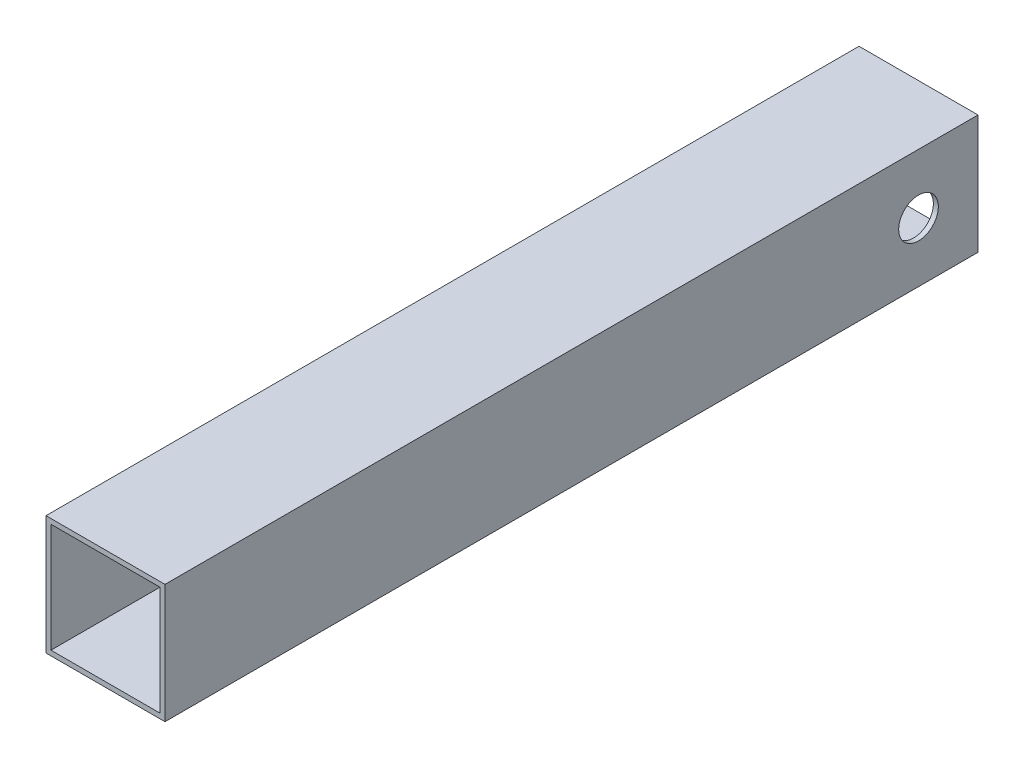
ISO-10303-21;
HEADER;
FILE_DESCRIPTION(('STEP AP214'),'2;1');
FILE_NAME('part.step','',(''),(''),'','','');
FILE_SCHEMA(('AUTOMOTIVE_DESIGN { 1 0 10303 214 1 1 1 1 }'));
ENDSEC;
DATA;
#1=APPLICATION_CONTEXT('core data for automotive mechanical design processes');
#2=APPLICATION_PROTOCOL_DEFINITION('international standard','automotive_design',2000,#1);
#3=PRODUCT_CONTEXT('',#1,'mechanical');
#4=PRODUCT('Part','Part','',(#3));
#5=PRODUCT_RELATED_PRODUCT_CATEGORY('part','',(#4));
#6=PRODUCT_DEFINITION_FORMATION('','',#4);
#7=PRODUCT_DEFINITION_CONTEXT('part definition',#1,'design');
#8=PRODUCT_DEFINITION('design','',#6,#7);
#9=PRODUCT_DEFINITION_SHAPE('','',#8);
#10=(LENGTH_UNIT() NAMED_UNIT(*) SI_UNIT(.MILLI.,.METRE.));
#11=(NAMED_UNIT(*) PLANE_ANGLE_UNIT() SI_UNIT($,.RADIAN.));
#12=(NAMED_UNIT(*) SI_UNIT($,.STERADIAN.) SOLID_ANGLE_UNIT());
#13=UNCERTAINTY_MEASURE_WITH_UNIT(LENGTH_MEASURE(1.E-05),#10,'distance_accuracy_value','');
#14=(GEOMETRIC_REPRESENTATION_CONTEXT(3) GLOBAL_UNCERTAINTY_ASSIGNED_CONTEXT((#13)) GLOBAL_UNIT_ASSIGNED_CONTEXT((#10,
#11,#12)) REPRESENTATION_CONTEXT('',''));
#15=CARTESIAN_POINT('',(0.,0.,0.));
#16=DIRECTION('',(0.,0.,1.));
#17=DIRECTION('',(1.,0.,0.));
#18=AXIS2_PLACEMENT_3D('',#15,#16,#17);
#19=CARTESIAN_POINT('',(0.,0.,260.35));
#20=DIRECTION('',(0.,0.,-1.));
#21=DIRECTION('',(-1.,0.,0.));
#22=AXIS2_PLACEMENT_3D('',#19,#20,#21);
#23=PLANE('',#22);
#24=DIRECTION('',(0.,-1.,0.));
#25=VECTOR('',#24,1.);
#26=CARTESIAN_POINT('',(0.,0.,260.35));
#27=LINE('',#26,#25);
#28=CARTESIAN_POINT('',(0.,38.1,260.35));
#29=VERTEX_POINT('',#28);
#30=CARTESIAN_POINT('',(0.,0.,260.35));
#31=VERTEX_POINT('',#30);
#32=EDGE_CURVE('E137',#29,#31,#27,.T.);
#33=ORIENTED_EDGE('',*,*,#32,.T.);
#34=DIRECTION('',(1.,0.,0.));
#35=VECTOR('',#34,1.);
#36=CARTESIAN_POINT('',(0.,0.,260.35));
#37=LINE('',#36,#35);
#38=CARTESIAN_POINT('',(38.1,0.,260.35));
#39=VERTEX_POINT('',#38);
#40=EDGE_CURVE('E140',#31,#39,#37,.T.);
#41=ORIENTED_EDGE('',*,*,#40,.T.);
#42=DIRECTION('',(0.,1.,0.));
#43=VECTOR('',#42,1.);
#44=CARTESIAN_POINT('',(38.1,0.,260.35));
#45=LINE('',#44,#43);
#46=CARTESIAN_POINT('',(38.1,38.1,260.35));
#47=VERTEX_POINT('',#46);
#48=EDGE_CURVE('E143',#39,#47,#45,.T.);
#49=ORIENTED_EDGE('',*,*,#48,.T.);
#50=DIRECTION('',(-1.,0.,0.));
#51=VECTOR('',#50,1.);
#52=CARTESIAN_POINT('',(0.,38.1,260.35));
#53=LINE('',#52,#51);
#54=EDGE_CURVE('E145',#47,#29,#53,.T.);
#55=ORIENTED_EDGE('',*,*,#54,.T.);
#56=EDGE_LOOP('',(#33,#41,#49,#55));
#57=FACE_BOUND('',#56,.T.);
#58=DIRECTION('',(0.,-1.,0.));
#59=VECTOR('',#58,1.);
#60=CARTESIAN_POINT('',(1.5875,1.5875,260.35));
#61=LINE('',#60,#59);
#62=CARTESIAN_POINT('',(1.5875,36.5125,260.35));
#63=VERTEX_POINT('',#62);
#64=CARTESIAN_POINT('',(1.5875,1.5875,260.35));
#65=VERTEX_POINT('',#64);
#66=EDGE_CURVE('E99',#63,#65,#61,.T.);
#67=ORIENTED_EDGE('',*,*,#66,.F.);
#68=DIRECTION('',(-1.,0.,0.));
#69=VECTOR('',#68,1.);
#70=CARTESIAN_POINT('',(1.5875,36.5125,260.35));
#71=LINE('',#70,#69);
#72=CARTESIAN_POINT('',(36.5125,36.5125,260.35));
#73=VERTEX_POINT('',#72);
#74=EDGE_CURVE('E121',#73,#63,#71,.T.);
#75=ORIENTED_EDGE('',*,*,#74,.F.);
#76=DIRECTION('',(0.,1.,0.));
#77=VECTOR('',#76,1.);
#78=CARTESIAN_POINT('',(36.5125,1.5875,260.35));
#79=LINE('',#78,#77);
#80=CARTESIAN_POINT('',(36.5125,1.5875,260.35));
#81=VERTEX_POINT('',#80);
#82=EDGE_CURVE('E119',#81,#73,#79,.T.);
#83=ORIENTED_EDGE('',*,*,#82,.F.);
#84=DIRECTION('',(1.,0.,0.));
#85=VECTOR('',#84,1.);
#86=CARTESIAN_POINT('',(1.5875,1.5875,260.35));
#87=LINE('',#86,#85);
#88=EDGE_CURVE('E107',#65,#81,#87,.T.);
#89=ORIENTED_EDGE('',*,*,#88,.F.);
#90=EDGE_LOOP('',(#67,#75,#83,#89));
#91=FACE_BOUND('',#90,.T.);
#92=ADVANCED_FACE('F33',(#57,#91),#23,.F.);
#93=CARTESIAN_POINT('',(0.,0.,0.));
#94=DIRECTION('',(0.,0.,-1.));
#95=DIRECTION('',(-1.,0.,0.));
#96=AXIS2_PLACEMENT_3D('',#93,#94,#95);
#97=PLANE('',#96);
#98=DIRECTION('',(0.,-1.,0.));
#99=VECTOR('',#98,1.);
#100=CARTESIAN_POINT('',(0.,0.,0.));
#101=LINE('',#100,#99);
#102=CARTESIAN_POINT('',(0.,38.1,0.));
#103=VERTEX_POINT('',#102);
#104=CARTESIAN_POINT('',(0.,0.,0.));
#105=VERTEX_POINT('',#104);
#106=EDGE_CURVE('E115',#103,#105,#101,.T.);
#107=ORIENTED_EDGE('',*,*,#106,.F.);
#108=DIRECTION('',(-1.,0.,0.));
#109=VECTOR('',#108,1.);
#110=CARTESIAN_POINT('',(0.,38.1,0.));
#111=LINE('',#110,#109);
#112=CARTESIAN_POINT('',(38.1,38.1,0.));
#113=VERTEX_POINT('',#112);
#114=EDGE_CURVE('E141',#113,#103,#111,.T.);
#115=ORIENTED_EDGE('',*,*,#114,.F.);
#116=DIRECTION('',(0.,1.,0.));
#117=VECTOR('',#116,1.);
#118=CARTESIAN_POINT('',(38.1,0.,0.));
#119=LINE('',#118,#117);
#120=CARTESIAN_POINT('',(38.1,0.,0.));
#121=VERTEX_POINT('',#120);
#122=EDGE_CURVE('E152',#121,#113,#119,.T.);
#123=ORIENTED_EDGE('',*,*,#122,.F.);
#124=DIRECTION('',(1.,0.,0.));
#125=VECTOR('',#124,1.);
#126=CARTESIAN_POINT('',(0.,0.,0.));
#127=LINE('',#126,#125);
#128=EDGE_CURVE('E150',#105,#121,#127,.T.);
#129=ORIENTED_EDGE('',*,*,#128,.F.);
#130=EDGE_LOOP('',(#107,#115,#123,#129));
#131=FACE_BOUND('',#130,.T.);
#132=DIRECTION('',(-1.,0.,0.));
#133=VECTOR('',#132,1.);
#134=CARTESIAN_POINT('',(1.5875,36.5125,0.));
#135=LINE('',#134,#133);
#136=CARTESIAN_POINT('',(36.5125,36.5125,0.));
#137=VERTEX_POINT('',#136);
#138=CARTESIAN_POINT('',(1.5875,36.5125,0.));
#139=VERTEX_POINT('',#138);
#140=EDGE_CURVE('E108',#137,#139,#135,.T.);
#141=ORIENTED_EDGE('',*,*,#140,.T.);
#142=DIRECTION('',(0.,-1.,0.));
#143=VECTOR('',#142,1.);
#144=CARTESIAN_POINT('',(1.5875,1.5875,0.));
#145=LINE('',#144,#143);
#146=CARTESIAN_POINT('',(1.5875,1.5875,0.));
#147=VERTEX_POINT('',#146);
#148=EDGE_CURVE('E57',#139,#147,#145,.T.);
#149=ORIENTED_EDGE('',*,*,#148,.T.);
#150=DIRECTION('',(1.,0.,0.));
#151=VECTOR('',#150,1.);
#152=CARTESIAN_POINT('',(1.5875,1.5875,0.));
#153=LINE('',#152,#151);
#154=CARTESIAN_POINT('',(36.5125,1.5875,0.));
#155=VERTEX_POINT('',#154);
#156=EDGE_CURVE('E114',#147,#155,#153,.T.);
#157=ORIENTED_EDGE('',*,*,#156,.T.);
#158=DIRECTION('',(0.,1.,0.));
#159=VECTOR('',#158,1.);
#160=CARTESIAN_POINT('',(36.5125,1.5875,0.));
#161=LINE('',#160,#159);
#162=EDGE_CURVE('E129',#155,#137,#161,.T.);
#163=ORIENTED_EDGE('',*,*,#162,.T.);
#164=EDGE_LOOP('',(#141,#149,#157,#163));
#165=FACE_BOUND('',#164,.T.);
#166=ADVANCED_FACE('F171',(#131,#165),#97,.T.);
#167=CARTESIAN_POINT('',(0.,0.,260.35));
#168=DIRECTION('',(1.,0.,0.));
#169=DIRECTION('',(0.,0.,-1.));
#170=AXIS2_PLACEMENT_3D('',#167,#168,#169);
#171=PLANE('',#170);
#172=CARTESIAN_POINT('',(0.,19.05,19.05));
#173=DIRECTION('',(-1.,0.,0.));
#174=DIRECTION('',(0.,0.,1.));
#175=AXIS2_PLACEMENT_3D('',#172,#173,#174);
#176=CIRCLE('',#175,6.35);
#177=CARTESIAN_POINT('',(0.,19.05,25.4));
#178=VERTEX_POINT('',#177);
#179=EDGE_CURVE('E219',#178,#178,#176,.T.);
#180=ORIENTED_EDGE('',*,*,#179,.F.);
#181=EDGE_LOOP('',(#180));
#182=FACE_BOUND('',#181,.T.);
#183=ORIENTED_EDGE('',*,*,#106,.T.);
#184=DIRECTION('',(0.,0.,-1.));
#185=VECTOR('',#184,1.);
#186=CARTESIAN_POINT('',(0.,0.,260.35));
#187=LINE('',#186,#185);
#188=EDGE_CURVE('E11',#31,#105,#187,.T.);
#189=ORIENTED_EDGE('',*,*,#188,.F.);
#190=ORIENTED_EDGE('',*,*,#32,.F.);
#191=DIRECTION('',(0.,0.,-1.));
#192=VECTOR('',#191,1.);
#193=CARTESIAN_POINT('',(0.,38.1,260.35));
#194=LINE('',#193,#192);
#195=EDGE_CURVE('E147',#29,#103,#194,.T.);
#196=ORIENTED_EDGE('',*,*,#195,.T.);
#197=EDGE_LOOP('',(#183,#189,#190,#196));
#198=FACE_BOUND('',#197,.T.);
#199=ADVANCED_FACE('F35',(#182,#198),#171,.F.);
#200=CARTESIAN_POINT('',(0.,0.,260.35));
#201=DIRECTION('',(0.,1.,0.));
#202=DIRECTION('',(0.,0.,1.));
#203=AXIS2_PLACEMENT_3D('',#200,#201,#202);
#204=PLANE('',#203);
#205=ORIENTED_EDGE('',*,*,#128,.T.);
#206=DIRECTION('',(0.,0.,-1.));
#207=VECTOR('',#206,1.);
#208=CARTESIAN_POINT('',(38.1,0.,260.35));
#209=LINE('',#208,#207);
#210=EDGE_CURVE('E42',#39,#121,#209,.T.);
#211=ORIENTED_EDGE('',*,*,#210,.F.);
#212=ORIENTED_EDGE('',*,*,#40,.F.);
#213=ORIENTED_EDGE('',*,*,#188,.T.);
#214=EDGE_LOOP('',(#205,#211,#212,#213));
#215=FACE_BOUND('',#214,.T.);
#216=ADVANCED_FACE('F181',(#215),#204,.F.);
#217=CARTESIAN_POINT('',(38.1,0.,260.35));
#218=DIRECTION('',(-1.,0.,0.));
#219=DIRECTION('',(0.,0.,1.));
#220=AXIS2_PLACEMENT_3D('',#217,#218,#219);
#221=PLANE('',#220);
#222=CARTESIAN_POINT('',(38.1,19.05,19.05));
#223=DIRECTION('',(-1.,0.,0.));
#224=DIRECTION('',(0.,0.,1.));
#225=AXIS2_PLACEMENT_3D('',#222,#223,#224);
#226=CIRCLE('',#225,6.34999999999999);
#227=CARTESIAN_POINT('',(38.1,19.05,25.4));
#228=VERTEX_POINT('',#227);
#229=EDGE_CURVE('E215',#228,#228,#226,.T.);
#230=ORIENTED_EDGE('',*,*,#229,.T.);
#231=EDGE_LOOP('',(#230));
#232=FACE_BOUND('',#231,.T.);
#233=ORIENTED_EDGE('',*,*,#122,.T.);
#234=DIRECTION('',(0.,0.,-1.));
#235=VECTOR('',#234,1.);
#236=CARTESIAN_POINT('',(38.1,38.1,260.35));
#237=LINE('',#236,#235);
#238=EDGE_CURVE('E157',#47,#113,#237,.T.);
#239=ORIENTED_EDGE('',*,*,#238,.F.);
#240=ORIENTED_EDGE('',*,*,#48,.F.);
#241=ORIENTED_EDGE('',*,*,#210,.T.);
#242=EDGE_LOOP('',(#233,#239,#240,#241));
#243=FACE_BOUND('',#242,.T.);
#244=ADVANCED_FACE('F165',(#232,#243),#221,.F.);
#245=CARTESIAN_POINT('',(0.,38.1,260.35));
#246=DIRECTION('',(0.,-1.,0.));
#247=DIRECTION('',(0.,0.,-1.));
#248=AXIS2_PLACEMENT_3D('',#245,#246,#247);
#249=PLANE('',#248);
#250=ORIENTED_EDGE('',*,*,#114,.T.);
#251=ORIENTED_EDGE('',*,*,#195,.F.);
#252=ORIENTED_EDGE('',*,*,#54,.F.);
#253=ORIENTED_EDGE('',*,*,#238,.T.);
#254=EDGE_LOOP('',(#250,#251,#252,#253));
#255=FACE_BOUND('',#254,.T.);
#256=ADVANCED_FACE('F175',(#255),#249,.F.);
#257=CARTESIAN_POINT('',(1.5875,1.5875,260.35));
#258=DIRECTION('',(1.,0.,0.));
#259=DIRECTION('',(0.,1.,0.));
#260=AXIS2_PLACEMENT_3D('',#257,#258,#259);
#261=PLANE('',#260);
#262=CARTESIAN_POINT('',(1.5875,19.05,19.05));
#263=DIRECTION('',(1.,0.,0.));
#264=DIRECTION('',(0.,1.,0.));
#265=AXIS2_PLACEMENT_3D('',#262,#263,#264);
#266=CIRCLE('',#265,6.34999999999999);
#267=CARTESIAN_POINT('',(1.5875,25.4,19.05));
#268=VERTEX_POINT('',#267);
#269=EDGE_CURVE('E127',#268,#268,#266,.T.);
#270=ORIENTED_EDGE('',*,*,#269,.F.);
#271=EDGE_LOOP('',(#270));
#272=FACE_BOUND('',#271,.T.);
#273=ORIENTED_EDGE('',*,*,#148,.F.);
#274=DIRECTION('',(0.,0.,-1.));
#275=VECTOR('',#274,1.);
#276=CARTESIAN_POINT('',(1.5875,36.5125,260.35));
#277=LINE('',#276,#275);
#278=EDGE_CURVE('E103',#63,#139,#277,.T.);
#279=ORIENTED_EDGE('',*,*,#278,.F.);
#280=ORIENTED_EDGE('',*,*,#66,.T.);
#281=DIRECTION('',(0.,0.,-1.));
#282=VECTOR('',#281,1.);
#283=CARTESIAN_POINT('',(1.5875,1.5875,260.35));
#284=LINE('',#283,#282);
#285=EDGE_CURVE('E102',#65,#147,#284,.T.);
#286=ORIENTED_EDGE('',*,*,#285,.T.);
#287=EDGE_LOOP('',(#273,#279,#280,#286));
#288=FACE_BOUND('',#287,.T.);
#289=ADVANCED_FACE('F101',(#272,#288),#261,.T.);
#290=CARTESIAN_POINT('',(1.5875,1.5875,260.35));
#291=DIRECTION('',(0.,1.,0.));
#292=DIRECTION('',(0.,0.,1.));
#293=AXIS2_PLACEMENT_3D('',#290,#291,#292);
#294=PLANE('',#293);
#295=ORIENTED_EDGE('',*,*,#156,.F.);
#296=ORIENTED_EDGE('',*,*,#285,.F.);
#297=ORIENTED_EDGE('',*,*,#88,.T.);
#298=DIRECTION('',(0.,0.,-1.));
#299=VECTOR('',#298,1.);
#300=CARTESIAN_POINT('',(36.5125,1.5875,260.35));
#301=LINE('',#300,#299);
#302=EDGE_CURVE('E116',#81,#155,#301,.T.);
#303=ORIENTED_EDGE('',*,*,#302,.T.);
#304=EDGE_LOOP('',(#295,#296,#297,#303));
#305=FACE_BOUND('',#304,.T.);
#306=ADVANCED_FACE('F111',(#305),#294,.T.);
#307=CARTESIAN_POINT('',(36.5125,1.5875,260.35));
#308=DIRECTION('',(-1.,0.,0.));
#309=DIRECTION('',(0.,0.,1.));
#310=AXIS2_PLACEMENT_3D('',#307,#308,#309);
#311=PLANE('',#310);
#312=CARTESIAN_POINT('',(36.5125,19.05,19.05));
#313=DIRECTION('',(-1.,0.,0.));
#314=DIRECTION('',(0.,0.,1.));
#315=AXIS2_PLACEMENT_3D('',#312,#313,#314);
#316=CIRCLE('',#315,6.34999999999999);
#317=CARTESIAN_POINT('',(36.5125,19.05,25.4));
#318=VERTEX_POINT('',#317);
#319=EDGE_CURVE('E37',#318,#318,#316,.T.);
#320=ORIENTED_EDGE('',*,*,#319,.F.);
#321=EDGE_LOOP('',(#320));
#322=FACE_BOUND('',#321,.T.);
#323=ORIENTED_EDGE('',*,*,#162,.F.);
#324=ORIENTED_EDGE('',*,*,#302,.F.);
#325=ORIENTED_EDGE('',*,*,#82,.T.);
#326=DIRECTION('',(0.,0.,-1.));
#327=VECTOR('',#326,1.);
#328=CARTESIAN_POINT('',(36.5125,36.5125,260.35));
#329=LINE('',#328,#327);
#330=EDGE_CURVE('E49',#73,#137,#329,.T.);
#331=ORIENTED_EDGE('',*,*,#330,.T.);
#332=EDGE_LOOP('',(#323,#324,#325,#331));
#333=FACE_BOUND('',#332,.T.);
#334=ADVANCED_FACE('F210',(#322,#333),#311,.T.);
#335=CARTESIAN_POINT('',(1.5875,36.5125,260.35));
#336=DIRECTION('',(0.,-1.,0.));
#337=DIRECTION('',(0.,0.,-1.));
#338=AXIS2_PLACEMENT_3D('',#335,#336,#337);
#339=PLANE('',#338);
#340=ORIENTED_EDGE('',*,*,#140,.F.);
#341=ORIENTED_EDGE('',*,*,#330,.F.);
#342=ORIENTED_EDGE('',*,*,#74,.T.);
#343=ORIENTED_EDGE('',*,*,#278,.T.);
#344=EDGE_LOOP('',(#340,#341,#342,#343));
#345=FACE_BOUND('',#344,.T.);
#346=ADVANCED_FACE('F230',(#345),#339,.T.);
#347=CARTESIAN_POINT('',(0.,19.05,19.05));
#348=DIRECTION('',(-1.,0.,0.));
#349=DIRECTION('',(0.,0.,1.));
#350=AXIS2_PLACEMENT_3D('',#347,#348,#349);
#351=CYLINDRICAL_SURFACE('',#350,6.34999999999999);
#352=ORIENTED_EDGE('',*,*,#319,.T.);
#353=EDGE_LOOP('',(#352));
#354=FACE_BOUND('',#353,.T.);
#355=ORIENTED_EDGE('',*,*,#229,.F.);
#356=EDGE_LOOP('',(#355));
#357=FACE_BOUND('',#356,.T.);
#358=ADVANCED_FACE('F225',(#354,#357),#351,.F.);
#359=ORIENTED_EDGE('',*,*,#269,.T.);
#360=EDGE_LOOP('',(#359));
#361=FACE_BOUND('',#360,.T.);
#362=ORIENTED_EDGE('',*,*,#179,.T.);
#363=EDGE_LOOP('',(#362));
#364=FACE_BOUND('',#363,.T.);
#365=ADVANCED_FACE('F223',(#361,#364),#351,.F.);
#366=CLOSED_SHELL('',(#92,#166,#199,#216,#244,#256,#289,#306,#334,#346,#358,#365));
#367=MANIFOLD_SOLID_BREP('B2',#366);
#368=ADVANCED_BREP_SHAPE_REPRESENTATION('',(#18,#367),#14);
#369=SHAPE_DEFINITION_REPRESENTATION(#9,#368);
ENDSEC;
END-ISO-10303-21;
